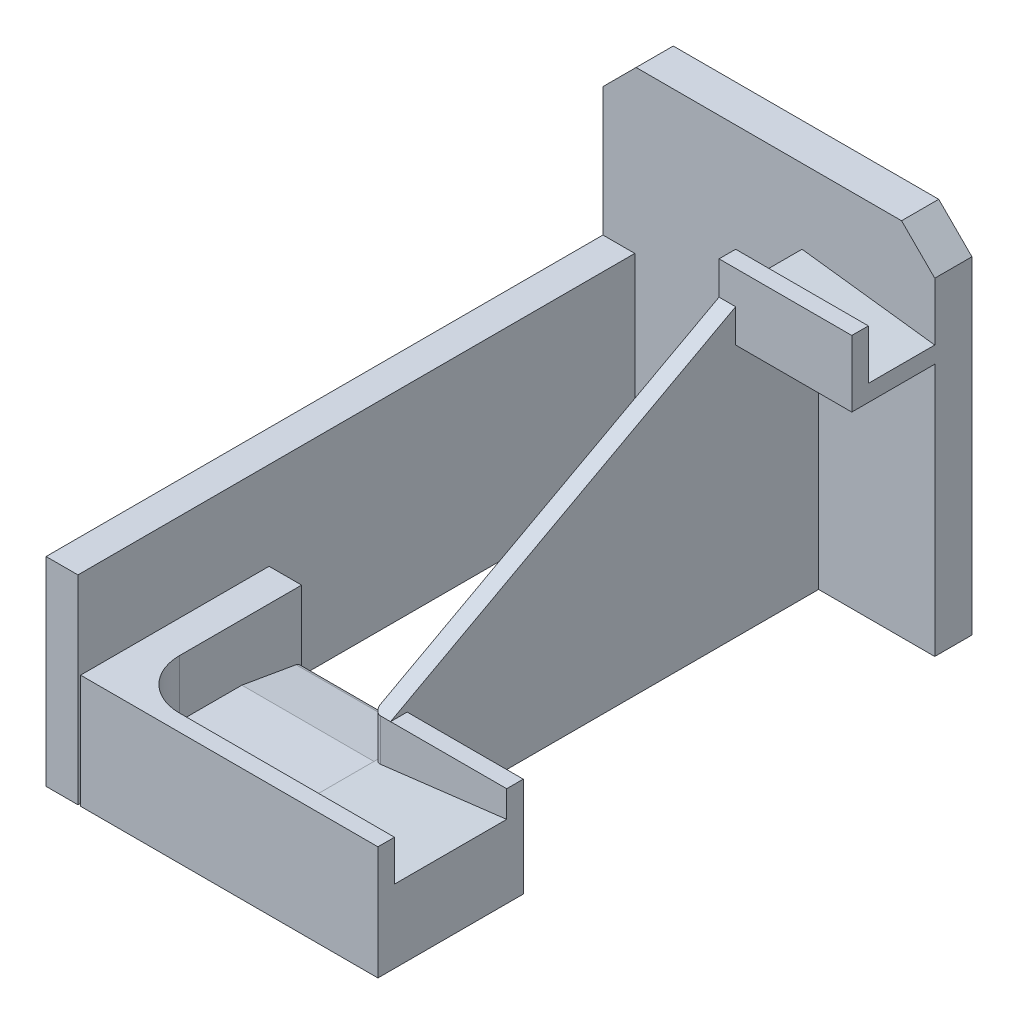
ISO-10303-21;
HEADER;
FILE_DESCRIPTION(('STEP AP214'),'2;1');
FILE_NAME('part.step','',(''),(''),'','','');
FILE_SCHEMA(('AUTOMOTIVE_DESIGN { 1 0 10303 214 1 1 1 1 }'));
ENDSEC;
DATA;
#1=APPLICATION_CONTEXT('core data for automotive mechanical design processes');
#2=APPLICATION_PROTOCOL_DEFINITION('international standard','automotive_design',2000,#1);
#3=PRODUCT_CONTEXT('',#1,'mechanical');
#4=PRODUCT('Part','Part','',(#3));
#5=PRODUCT_RELATED_PRODUCT_CATEGORY('part','',(#4));
#6=PRODUCT_DEFINITION_FORMATION('','',#4);
#7=PRODUCT_DEFINITION_CONTEXT('part definition',#1,'design');
#8=PRODUCT_DEFINITION('design','',#6,#7);
#9=PRODUCT_DEFINITION_SHAPE('','',#8);
#10=(LENGTH_UNIT() NAMED_UNIT(*) SI_UNIT(.MILLI.,.METRE.));
#11=(NAMED_UNIT(*) PLANE_ANGLE_UNIT() SI_UNIT($,.RADIAN.));
#12=(NAMED_UNIT(*) SI_UNIT($,.STERADIAN.) SOLID_ANGLE_UNIT());
#13=UNCERTAINTY_MEASURE_WITH_UNIT(LENGTH_MEASURE(1.E-05),#10,'distance_accuracy_value','');
#14=(GEOMETRIC_REPRESENTATION_CONTEXT(3) GLOBAL_UNCERTAINTY_ASSIGNED_CONTEXT((#13)) GLOBAL_UNIT_ASSIGNED_CONTEXT((#10,
#11,#12)) REPRESENTATION_CONTEXT('',''));
#15=CARTESIAN_POINT('',(0.,0.,0.));
#16=DIRECTION('',(0.,0.,1.));
#17=DIRECTION('',(1.,0.,0.));
#18=AXIS2_PLACEMENT_3D('',#15,#16,#17);
#19=CARTESIAN_POINT('',(10.1,0.,0.));
#20=DIRECTION('',(1.,0.,0.));
#21=DIRECTION('',(0.,0.,-1.));
#22=AXIS2_PLACEMENT_3D('',#19,#20,#21);
#23=PLANE('',#22);
#24=DIRECTION('',(0.,0.,-1.));
#25=VECTOR('',#24,1.);
#26=CARTESIAN_POINT('',(10.1,17.12,61.1));
#27=LINE('',#26,#25);
#28=CARTESIAN_POINT('',(10.1,17.12,79.4999999999999));
#29=VERTEX_POINT('',#28);
#30=CARTESIAN_POINT('',(10.1,17.12,61.1));
#31=VERTEX_POINT('',#30);
#32=EDGE_CURVE('E268',#29,#31,#27,.T.);
#33=ORIENTED_EDGE('',*,*,#32,.F.);
#34=DIRECTION('',(0.,-1.,0.));
#35=VECTOR('',#34,1.);
#36=CARTESIAN_POINT('',(10.1,27.7266017177982,79.4999999999999));
#37=LINE('',#36,#35);
#38=CARTESIAN_POINT('',(10.1,8.55999999999962,79.4999999999999));
#39=VERTEX_POINT('',#38);
#40=EDGE_CURVE('E266',#29,#39,#37,.T.);
#41=ORIENTED_EDGE('',*,*,#40,.T.);
#42=DIRECTION('',(0.,0.,1.));
#43=VECTOR('',#42,1.);
#44=CARTESIAN_POINT('',(10.1,8.55999999999993,70.1));
#45=LINE('',#44,#43);
#46=CARTESIAN_POINT('',(10.1,8.55999999999993,70.1));
#47=VERTEX_POINT('',#46);
#48=EDGE_CURVE('E251',#47,#39,#45,.T.);
#49=ORIENTED_EDGE('',*,*,#48,.F.);
#50=DIRECTION('',(0.,0.17078672353593,0.985308020399642));
#51=VECTOR('',#50,1.);
#52=CARTESIAN_POINT('',(10.1,7.,61.1));
#53=LINE('',#52,#51);
#54=CARTESIAN_POINT('',(10.1,7.14373030125377,61.9292132764641));
#55=VERTEX_POINT('',#54);
#56=EDGE_CURVE('E449',#55,#47,#53,.T.);
#57=ORIENTED_EDGE('',*,*,#56,.F.);
#58=CARTESIAN_POINT('',(10.1,6.15842228085412,62.1));
#59=DIRECTION('',(1.,0.,0.));
#60=DIRECTION('',(0.,0.,-1.));
#61=AXIS2_PLACEMENT_3D('',#58,#59,#60);
#62=CIRCLE('',#61,1.);
#63=CARTESIAN_POINT('',(10.1,6.15842228085412,61.1));
#64=VERTEX_POINT('',#63);
#65=EDGE_CURVE('E503',#55,#64,#62,.F.);
#66=ORIENTED_EDGE('',*,*,#65,.T.);
#67=DIRECTION('',(0.,-1.,0.));
#68=VECTOR('',#67,1.);
#69=CARTESIAN_POINT('',(10.1,0.,61.1));
#70=LINE('',#69,#68);
#71=EDGE_CURVE('E476',#31,#64,#70,.T.);
#72=ORIENTED_EDGE('',*,*,#71,.F.);
#73=EDGE_LOOP('',(#33,#41,#49,#57,#66,#72));
#74=FACE_BOUND('',#73,.T.);
#75=ADVANCED_FACE('F35',(#74),#23,.T.);
#76=CARTESIAN_POINT('',(57.2778958132771,8.55999999999993,70.1));
#77=DIRECTION('',(0.,-1.,0.));
#78=DIRECTION('',(0.,0.,-1.));
#79=AXIS2_PLACEMENT_3D('',#76,#77,#78);
#80=PLANE('',#79);
#81=CARTESIAN_POINT('',(17.6,8.55999999999962,79.4999999999999));
#82=DIRECTION('',(0.,-1.,0.));
#83=DIRECTION('',(0.,0.,1.));
#84=AXIS2_PLACEMENT_3D('',#81,#82,#83);
#85=CIRCLE('',#84,7.50000000000001);
#86=CARTESIAN_POINT('',(17.6,8.56,87.));
#87=VERTEX_POINT('',#86);
#88=EDGE_CURVE('E256',#87,#39,#85,.T.);
#89=ORIENTED_EDGE('',*,*,#88,.F.);
#90=DIRECTION('',(-1.,0.,0.));
#91=VECTOR('',#90,1.);
#92=CARTESIAN_POINT('',(57.2778958132771,8.56,87.));
#93=LINE('',#92,#91);
#94=CARTESIAN_POINT('',(30.,8.56,87.));
#95=VERTEX_POINT('',#94);
#96=EDGE_CURVE('E263',#95,#87,#93,.T.);
#97=ORIENTED_EDGE('',*,*,#96,.F.);
#98=DIRECTION('',(0.,0.,1.));
#99=VECTOR('',#98,1.);
#100=CARTESIAN_POINT('',(30.,8.55999999999993,70.1));
#101=LINE('',#100,#99);
#102=CARTESIAN_POINT('',(30.,8.55999999999993,70.1));
#103=VERTEX_POINT('',#102);
#104=EDGE_CURVE('E452',#103,#95,#101,.T.);
#105=ORIENTED_EDGE('',*,*,#104,.F.);
#106=DIRECTION('',(-1.,0.,0.));
#107=VECTOR('',#106,1.);
#108=CARTESIAN_POINT('',(57.2778958132771,8.55999999999993,70.1));
#109=LINE('',#108,#107);
#110=EDGE_CURVE('E260',#103,#47,#109,.T.);
#111=ORIENTED_EDGE('',*,*,#110,.T.);
#112=ORIENTED_EDGE('',*,*,#48,.T.);
#113=EDGE_LOOP('',(#89,#97,#105,#111,#112));
#114=FACE_BOUND('',#113,.T.);
#115=ADVANCED_FACE('F253',(#114),#80,.F.);
#116=CARTESIAN_POINT('',(0.,0.,5.6));
#117=DIRECTION('',(0.,0.,-1.));
#118=DIRECTION('',(-1.,0.,0.));
#119=AXIS2_PLACEMENT_3D('',#116,#117,#118);
#120=PLANE('',#119);
#121=DIRECTION('',(0.,1.,0.));
#122=VECTOR('',#121,1.);
#123=CARTESIAN_POINT('',(4.8,0.,5.6));
#124=LINE('',#123,#122);
#125=CARTESIAN_POINT('',(4.8,0.,5.6));
#126=VERTEX_POINT('',#125);
#127=CARTESIAN_POINT('',(4.8,30.,5.6));
#128=VERTEX_POINT('',#127);
#129=EDGE_CURVE('E287',#126,#128,#124,.T.);
#130=ORIENTED_EDGE('',*,*,#129,.F.);
#131=DIRECTION('',(1.,0.,0.));
#132=VECTOR('',#131,1.);
#133=CARTESIAN_POINT('',(0.,0.,5.6));
#134=LINE('',#133,#132);
#135=CARTESIAN_POINT('',(30.,0.,5.6));
#136=VERTEX_POINT('',#135);
#137=EDGE_CURVE('E409',#126,#136,#134,.T.);
#138=ORIENTED_EDGE('',*,*,#137,.T.);
#139=DIRECTION('',(0.,1.,0.));
#140=VECTOR('',#139,1.);
#141=CARTESIAN_POINT('',(30.,43.145,5.60000000001537));
#142=LINE('',#141,#140);
#143=CARTESIAN_POINT('',(30.,43.145,5.60000000001537));
#144=VERTEX_POINT('',#143);
#145=EDGE_CURVE('E393',#136,#144,#142,.T.);
#146=ORIENTED_EDGE('',*,*,#145,.T.);
#147=DIRECTION('',(0.992277876713668,-0.124034734589208,0.));
#148=VECTOR('',#147,1.);
#149=CARTESIAN_POINT('',(30.,43.145,5.60000000001537));
#150=LINE('',#149,#148);
#151=CARTESIAN_POINT('',(50.,40.645,5.60000000001537));
#152=VERTEX_POINT('',#151);
#153=EDGE_CURVE('E400',#144,#152,#150,.T.);
#154=ORIENTED_EDGE('',*,*,#153,.T.);
#155=DIRECTION('',(0.,1.,0.));
#156=VECTOR('',#155,1.);
#157=CARTESIAN_POINT('',(50.,0.,5.6));
#158=LINE('',#157,#156);
#159=CARTESIAN_POINT('',(50.,49.365,5.6));
#160=VERTEX_POINT('',#159);
#161=EDGE_CURVE('E411',#152,#160,#158,.T.);
#162=ORIENTED_EDGE('',*,*,#161,.T.);
#163=DIRECTION('',(-0.707106781186547,0.707106781186547,0.));
#164=VECTOR('',#163,1.);
#165=CARTESIAN_POINT('',(45.,54.365,5.6));
#166=LINE('',#165,#164);
#167=CARTESIAN_POINT('',(45.,54.365,5.6));
#168=VERTEX_POINT('',#167);
#169=EDGE_CURVE('E415',#160,#168,#166,.T.);
#170=ORIENTED_EDGE('',*,*,#169,.T.);
#171=DIRECTION('',(-1.,0.,0.));
#172=VECTOR('',#171,1.);
#173=CARTESIAN_POINT('',(5.,54.365,5.6));
#174=LINE('',#173,#172);
#175=CARTESIAN_POINT('',(5.,54.365,5.6));
#176=VERTEX_POINT('',#175);
#177=EDGE_CURVE('E417',#168,#176,#174,.T.);
#178=ORIENTED_EDGE('',*,*,#177,.T.);
#179=DIRECTION('',(-0.707106781186548,-0.707106781186547,0.));
#180=VECTOR('',#179,1.);
#181=CARTESIAN_POINT('',(0.,49.365,5.6));
#182=LINE('',#181,#180);
#183=CARTESIAN_POINT('',(0.,49.365,5.6));
#184=VERTEX_POINT('',#183);
#185=EDGE_CURVE('E419',#176,#184,#182,.T.);
#186=ORIENTED_EDGE('',*,*,#185,.T.);
#187=DIRECTION('',(0.,-1.,0.));
#188=VECTOR('',#187,1.);
#189=CARTESIAN_POINT('',(0.,0.,5.6));
#190=LINE('',#189,#188);
#191=CARTESIAN_POINT('',(0.,30.,5.6));
#192=VERTEX_POINT('',#191);
#193=EDGE_CURVE('E405',#184,#192,#190,.T.);
#194=ORIENTED_EDGE('',*,*,#193,.T.);
#195=DIRECTION('',(-1.,0.,0.));
#196=VECTOR('',#195,1.);
#197=CARTESIAN_POINT('',(0.,30.,5.6));
#198=LINE('',#197,#196);
#199=EDGE_CURVE('E282',#128,#192,#198,.T.);
#200=ORIENTED_EDGE('',*,*,#199,.F.);
#201=EDGE_LOOP('',(#130,#138,#146,#154,#162,#170,#178,#186,#194,#200));
#202=FACE_BOUND('',#201,.T.);
#203=ADVANCED_FACE('F582',(#202),#120,.F.);
#204=CARTESIAN_POINT('',(0.,0.,87.));
#205=DIRECTION('',(0.,0.,-1.));
#206=DIRECTION('',(-1.,0.,0.));
#207=AXIS2_PLACEMENT_3D('',#204,#205,#206);
#208=PLANE('',#207);
#209=DIRECTION('',(0.,-1.,0.));
#210=VECTOR('',#209,1.);
#211=CARTESIAN_POINT('',(17.6,27.7266017177982,87.));
#212=LINE('',#211,#210);
#213=CARTESIAN_POINT('',(17.6,17.1199999999999,87.));
#214=VERTEX_POINT('',#213);
#215=EDGE_CURVE('E276',#214,#87,#212,.T.);
#216=ORIENTED_EDGE('',*,*,#215,.F.);
#217=DIRECTION('',(-1.,0.,0.));
#218=VECTOR('',#217,1.);
#219=CARTESIAN_POINT('',(10.1,17.1199999999999,87.));
#220=LINE('',#219,#218);
#221=CARTESIAN_POINT('',(50.,17.1199999999999,87.));
#222=VERTEX_POINT('',#221);
#223=EDGE_CURVE('E464',#222,#214,#220,.T.);
#224=ORIENTED_EDGE('',*,*,#223,.F.);
#225=DIRECTION('',(0.,1.,0.));
#226=VECTOR('',#225,1.);
#227=CARTESIAN_POINT('',(50.,0.,87.));
#228=LINE('',#227,#226);
#229=CARTESIAN_POINT('',(50.,11.,87.));
#230=VERTEX_POINT('',#229);
#231=EDGE_CURVE('E462',#230,#222,#228,.T.);
#232=ORIENTED_EDGE('',*,*,#231,.F.);
#233=DIRECTION('',(0.992640057880681,0.121102087061447,0.));
#234=VECTOR('',#233,1.);
#235=CARTESIAN_POINT('',(30.,8.55999999999993,86.9999999999891));
#236=LINE('',#235,#234);
#237=EDGE_CURVE('E313',#95,#230,#236,.T.);
#238=ORIENTED_EDGE('',*,*,#237,.F.);
#239=ORIENTED_EDGE('',*,*,#96,.T.);
#240=EDGE_LOOP('',(#216,#224,#232,#238,#239));
#241=FACE_BOUND('',#240,.T.);
#242=ADVANCED_FACE('F580',(#241),#208,.T.);
#243=CARTESIAN_POINT('',(32.5,15.,70.1));
#244=DIRECTION('',(0.,0.,1.));
#245=DIRECTION('',(1.,0.,0.));
#246=AXIS2_PLACEMENT_3D('',#243,#244,#245);
#247=PLANE('',#246);
#248=DIRECTION('',(-1.,0.,0.));
#249=VECTOR('',#248,1.);
#250=CARTESIAN_POINT('',(32.5,15.,70.1));
#251=LINE('',#250,#249);
#252=CARTESIAN_POINT('',(32.5,15.,70.1));
#253=VERTEX_POINT('',#252);
#254=CARTESIAN_POINT('',(31.,15.,70.1));
#255=VERTEX_POINT('',#254);
#256=EDGE_CURVE('E352',#253,#255,#251,.T.);
#257=ORIENTED_EDGE('',*,*,#256,.T.);
#258=DIRECTION('',(0.,1.,0.));
#259=VECTOR('',#258,1.);
#260=CARTESIAN_POINT('',(31.,8.55999999999993,70.1));
#261=LINE('',#260,#259);
#262=CARTESIAN_POINT('',(31.,8.68199999999993,70.1));
#263=VERTEX_POINT('',#262);
#264=EDGE_CURVE('E43',#255,#263,#261,.F.);
#265=ORIENTED_EDGE('',*,*,#264,.T.);
#266=DIRECTION('',(-0.992640057880681,-0.121102087061447,0.));
#267=VECTOR('',#266,1.);
#268=CARTESIAN_POINT('',(30.,8.55999999999993,70.1));
#269=LINE('',#268,#267);
#270=CARTESIAN_POINT('',(50.,11.,70.1));
#271=VERTEX_POINT('',#270);
#272=EDGE_CURVE('E294',#271,#263,#269,.T.);
#273=ORIENTED_EDGE('',*,*,#272,.F.);
#274=DIRECTION('',(0.,1.,0.));
#275=VECTOR('',#274,1.);
#276=CARTESIAN_POINT('',(50.,0.,70.1));
#277=LINE('',#276,#275);
#278=CARTESIAN_POINT('',(50.,15.,70.1));
#279=VERTEX_POINT('',#278);
#280=EDGE_CURVE('E316',#271,#279,#277,.T.);
#281=ORIENTED_EDGE('',*,*,#280,.T.);
#282=DIRECTION('',(-1.,0.,0.));
#283=VECTOR('',#282,1.);
#284=CARTESIAN_POINT('',(32.5,15.,70.1));
#285=LINE('',#284,#283);
#286=EDGE_CURVE('E321',#279,#253,#285,.T.);
#287=ORIENTED_EDGE('',*,*,#286,.T.);
#288=EDGE_LOOP('',(#257,#265,#273,#281,#287));
#289=FACE_BOUND('',#288,.T.);
#290=ADVANCED_FACE('F520',(#289),#247,.T.);
#291=CARTESIAN_POINT('',(10.1,0.,61.1));
#292=DIRECTION('',(0.,0.,-1.));
#293=DIRECTION('',(-1.,0.,0.));
#294=AXIS2_PLACEMENT_3D('',#291,#292,#293);
#295=PLANE('',#294);
#296=ORIENTED_EDGE('',*,*,#71,.T.);
#297=DIRECTION('',(-1.,0.,0.));
#298=VECTOR('',#297,1.);
#299=CARTESIAN_POINT('',(30.,6.15842228085412,61.1));
#300=LINE('',#299,#298);
#301=CARTESIAN_POINT('',(30.,6.15842228085412,61.1));
#302=VERTEX_POINT('',#301);
#303=EDGE_CURVE('E501',#64,#302,#300,.F.);
#304=ORIENTED_EDGE('',*,*,#303,.T.);
#305=DIRECTION('',(0.,1.,0.));
#306=VECTOR('',#305,1.);
#307=CARTESIAN_POINT('',(30.,0.,61.1));
#308=LINE('',#307,#306);
#309=CARTESIAN_POINT('',(30.,0.,61.1));
#310=VERTEX_POINT('',#309);
#311=EDGE_CURVE('E457',#310,#302,#308,.T.);
#312=ORIENTED_EDGE('',*,*,#311,.F.);
#313=DIRECTION('',(-1.,0.,0.));
#314=VECTOR('',#313,1.);
#315=CARTESIAN_POINT('',(10.1,0.,61.1));
#316=LINE('',#315,#314);
#317=CARTESIAN_POINT('',(5.2,0.,61.1));
#318=VERTEX_POINT('',#317);
#319=EDGE_CURVE('E480',#310,#318,#316,.T.);
#320=ORIENTED_EDGE('',*,*,#319,.T.);
#321=DIRECTION('',(0.,-1.,0.));
#322=VECTOR('',#321,1.);
#323=CARTESIAN_POINT('',(5.2,0.,61.1));
#324=LINE('',#323,#322);
#325=CARTESIAN_POINT('',(5.2,17.12,61.1));
#326=VERTEX_POINT('',#325);
#327=EDGE_CURVE('E473',#326,#318,#324,.T.);
#328=ORIENTED_EDGE('',*,*,#327,.F.);
#329=DIRECTION('',(-1.,0.,0.));
#330=VECTOR('',#329,1.);
#331=CARTESIAN_POINT('',(10.1,17.12,61.1));
#332=LINE('',#331,#330);
#333=EDGE_CURVE('E491',#31,#326,#332,.T.);
#334=ORIENTED_EDGE('',*,*,#333,.F.);
#335=EDGE_LOOP('',(#296,#304,#312,#320,#328,#334));
#336=FACE_BOUND('',#335,.T.);
#337=ADVANCED_FACE('F571',(#336),#295,.T.);
#338=CARTESIAN_POINT('',(10.1,17.12,61.1));
#339=DIRECTION('',(0.,1.,0.));
#340=DIRECTION('',(0.,0.,1.));
#341=AXIS2_PLACEMENT_3D('',#338,#339,#340);
#342=PLANE('',#341);
#343=CARTESIAN_POINT('',(17.6,17.12,79.4999999999999));
#344=DIRECTION('',(0.,1.,0.));
#345=DIRECTION('',(0.,0.,1.));
#346=AXIS2_PLACEMENT_3D('',#343,#344,#345);
#347=CIRCLE('',#346,7.50000000000001);
#348=EDGE_CURVE('E272',#214,#29,#347,.F.);
#349=ORIENTED_EDGE('',*,*,#348,.T.);
#350=ORIENTED_EDGE('',*,*,#32,.T.);
#351=ORIENTED_EDGE('',*,*,#333,.T.);
#352=DIRECTION('',(0.,0.,-1.));
#353=VECTOR('',#352,1.);
#354=CARTESIAN_POINT('',(5.2,17.12,61.1));
#355=LINE('',#354,#353);
#356=CARTESIAN_POINT('',(5.2,17.12,89.5));
#357=VERTEX_POINT('',#356);
#358=EDGE_CURVE('E478',#357,#326,#355,.T.);
#359=ORIENTED_EDGE('',*,*,#358,.F.);
#360=DIRECTION('',(-1.,0.,0.));
#361=VECTOR('',#360,1.);
#362=CARTESIAN_POINT('',(10.1,17.12,89.5));
#363=LINE('',#362,#361);
#364=CARTESIAN_POINT('',(50.,17.1199999999999,89.5));
#365=VERTEX_POINT('',#364);
#366=EDGE_CURVE('E494',#365,#357,#363,.T.);
#367=ORIENTED_EDGE('',*,*,#366,.F.);
#368=DIRECTION('',(0.,0.,1.));
#369=VECTOR('',#368,1.);
#370=CARTESIAN_POINT('',(50.,17.1199999999999,87.));
#371=LINE('',#370,#369);
#372=EDGE_CURVE('E470',#222,#365,#371,.T.);
#373=ORIENTED_EDGE('',*,*,#372,.F.);
#374=ORIENTED_EDGE('',*,*,#223,.T.);
#375=EDGE_LOOP('',(#349,#350,#351,#359,#367,#373,#374));
#376=FACE_BOUND('',#375,.T.);
#377=ADVANCED_FACE('F578',(#376),#342,.T.);
#378=CARTESIAN_POINT('',(10.1,0.,89.5));
#379=DIRECTION('',(0.,0.,1.));
#380=DIRECTION('',(0.,-1.,0.));
#381=AXIS2_PLACEMENT_3D('',#378,#379,#380);
#382=PLANE('',#381);
#383=DIRECTION('',(0.,1.,0.));
#384=VECTOR('',#383,1.);
#385=CARTESIAN_POINT('',(5.2,0.,89.5));
#386=LINE('',#385,#384);
#387=CARTESIAN_POINT('',(5.2,0.,89.5));
#388=VERTEX_POINT('',#387);
#389=EDGE_CURVE('E486',#388,#357,#386,.T.);
#390=ORIENTED_EDGE('',*,*,#389,.F.);
#391=DIRECTION('',(-1.,0.,0.));
#392=VECTOR('',#391,1.);
#393=CARTESIAN_POINT('',(10.1,0.,89.5));
#394=LINE('',#393,#392);
#395=CARTESIAN_POINT('',(50.,0.,89.5));
#396=VERTEX_POINT('',#395);
#397=EDGE_CURVE('E496',#396,#388,#394,.T.);
#398=ORIENTED_EDGE('',*,*,#397,.F.);
#399=DIRECTION('',(0.,1.,0.));
#400=VECTOR('',#399,1.);
#401=CARTESIAN_POINT('',(50.,0.,89.5));
#402=LINE('',#401,#400);
#403=EDGE_CURVE('E454',#396,#365,#402,.T.);
#404=ORIENTED_EDGE('',*,*,#403,.T.);
#405=ORIENTED_EDGE('',*,*,#366,.T.);
#406=EDGE_LOOP('',(#390,#398,#404,#405));
#407=FACE_BOUND('',#406,.T.);
#408=ADVANCED_FACE('F606',(#407),#382,.T.);
#409=CARTESIAN_POINT('',(10.1,0.,61.1));
#410=DIRECTION('',(0.,-1.,0.));
#411=DIRECTION('',(0.,0.,-1.));
#412=AXIS2_PLACEMENT_3D('',#409,#410,#411);
#413=PLANE('',#412);
#414=DIRECTION('',(1.,0.,0.));
#415=VECTOR('',#414,1.);
#416=CARTESIAN_POINT('',(32.5,0.,67.6));
#417=LINE('',#416,#415);
#418=CARTESIAN_POINT('',(32.5,0.,67.6));
#419=VERTEX_POINT('',#418);
#420=CARTESIAN_POINT('',(50.,0.,67.6));
#421=VERTEX_POINT('',#420);
#422=EDGE_CURVE('E320',#419,#421,#417,.T.);
#423=ORIENTED_EDGE('',*,*,#422,.T.);
#424=DIRECTION('',(0.,0.,1.));
#425=VECTOR('',#424,1.);
#426=CARTESIAN_POINT('',(50.,0.,87.));
#427=LINE('',#426,#425);
#428=EDGE_CURVE('E467',#421,#396,#427,.T.);
#429=ORIENTED_EDGE('',*,*,#428,.T.);
#430=ORIENTED_EDGE('',*,*,#397,.T.);
#431=DIRECTION('',(0.,0.,1.));
#432=VECTOR('',#431,1.);
#433=CARTESIAN_POINT('',(5.2,0.,61.1));
#434=LINE('',#433,#432);
#435=EDGE_CURVE('E483',#318,#388,#434,.T.);
#436=ORIENTED_EDGE('',*,*,#435,.F.);
#437=ORIENTED_EDGE('',*,*,#319,.F.);
#438=DIRECTION('',(0.,0.,1.));
#439=VECTOR('',#438,1.);
#440=CARTESIAN_POINT('',(30.,0.,70.1));
#441=LINE('',#440,#439);
#442=EDGE_CURVE('E336',#136,#310,#441,.T.);
#443=ORIENTED_EDGE('',*,*,#442,.F.);
#444=ORIENTED_EDGE('',*,*,#137,.F.);
#445=DIRECTION('',(0.,0.,-1.));
#446=VECTOR('',#445,1.);
#447=CARTESIAN_POINT('',(4.8,0.,119.881573362813));
#448=LINE('',#447,#446);
#449=CARTESIAN_POINT('',(4.8,0.,89.5));
#450=VERTEX_POINT('',#449);
#451=EDGE_CURVE('E290',#450,#126,#448,.T.);
#452=ORIENTED_EDGE('',*,*,#451,.F.);
#453=DIRECTION('',(1.,0.,0.));
#454=VECTOR('',#453,1.);
#455=CARTESIAN_POINT('',(0.,0.,89.5));
#456=LINE('',#455,#454);
#457=CARTESIAN_POINT('',(0.,0.,89.5));
#458=VERTEX_POINT('',#457);
#459=EDGE_CURVE('E295',#458,#450,#456,.T.);
#460=ORIENTED_EDGE('',*,*,#459,.F.);
#461=DIRECTION('',(0.,0.,-1.));
#462=VECTOR('',#461,1.);
#463=CARTESIAN_POINT('',(0.,0.,5.6));
#464=LINE('',#463,#462);
#465=CARTESIAN_POINT('',(0.,0.,0.));
#466=VERTEX_POINT('',#465);
#467=EDGE_CURVE('E447',#458,#466,#464,.T.);
#468=ORIENTED_EDGE('',*,*,#467,.T.);
#469=DIRECTION('',(1.,0.,0.));
#470=VECTOR('',#469,1.);
#471=CARTESIAN_POINT('',(0.,0.,0.));
#472=LINE('',#471,#470);
#473=CARTESIAN_POINT('',(50.,0.,0.));
#474=VERTEX_POINT('',#473);
#475=EDGE_CURVE('E424',#466,#474,#472,.T.);
#476=ORIENTED_EDGE('',*,*,#475,.T.);
#477=DIRECTION('',(0.,0.,-1.));
#478=VECTOR('',#477,1.);
#479=CARTESIAN_POINT('',(50.,0.,5.6));
#480=LINE('',#479,#478);
#481=CARTESIAN_POINT('',(50.,0.,5.6));
#482=VERTEX_POINT('',#481);
#483=EDGE_CURVE('E444',#482,#474,#480,.T.);
#484=ORIENTED_EDGE('',*,*,#483,.F.);
#485=CARTESIAN_POINT('',(32.5,0.,5.6));
#486=VERTEX_POINT('',#485);
#487=EDGE_CURVE('E407',#486,#482,#134,.T.);
#488=ORIENTED_EDGE('',*,*,#487,.F.);
#489=DIRECTION('',(0.,0.,1.));
#490=VECTOR('',#489,1.);
#491=CARTESIAN_POINT('',(32.5,0.,70.1));
#492=LINE('',#491,#490);
#493=EDGE_CURVE('E346',#486,#419,#492,.T.);
#494=ORIENTED_EDGE('',*,*,#493,.T.);
#495=EDGE_LOOP('',(#423,#429,#430,#436,#437,#443,#444,#452,#460,#468,#476,#484,#488,#494));
#496=FACE_BOUND('',#495,.T.);
#497=ADVANCED_FACE('F565',(#496),#413,.T.);
#498=CARTESIAN_POINT('',(5.2,0.,0.));
#499=DIRECTION('',(1.,0.,0.));
#500=DIRECTION('',(0.,0.,-1.));
#501=AXIS2_PLACEMENT_3D('',#498,#499,#500);
#502=PLANE('',#501);
#503=ORIENTED_EDGE('',*,*,#327,.T.);
#504=ORIENTED_EDGE('',*,*,#435,.T.);
#505=ORIENTED_EDGE('',*,*,#389,.T.);
#506=ORIENTED_EDGE('',*,*,#358,.T.);
#507=EDGE_LOOP('',(#503,#504,#505,#506));
#508=FACE_BOUND('',#507,.T.);
#509=ADVANCED_FACE('F600',(#508),#502,.F.);
#510=CARTESIAN_POINT('',(50.,0.,87.));
#511=DIRECTION('',(1.,0.,0.));
#512=DIRECTION('',(0.,0.,-1.));
#513=AXIS2_PLACEMENT_3D('',#510,#511,#512);
#514=PLANE('',#513);
#515=ORIENTED_EDGE('',*,*,#403,.F.);
#516=ORIENTED_EDGE('',*,*,#428,.F.);
#517=DIRECTION('',(0.,1.,0.));
#518=VECTOR('',#517,1.);
#519=CARTESIAN_POINT('',(50.,0.,67.6));
#520=LINE('',#519,#518);
#521=CARTESIAN_POINT('',(50.,15.,67.6));
#522=VERTEX_POINT('',#521);
#523=EDGE_CURVE('E324',#421,#522,#520,.T.);
#524=ORIENTED_EDGE('',*,*,#523,.T.);
#525=DIRECTION('',(0.,0.,1.));
#526=VECTOR('',#525,1.);
#527=CARTESIAN_POINT('',(50.,15.,67.6));
#528=LINE('',#527,#526);
#529=EDGE_CURVE('E330',#522,#279,#528,.T.);
#530=ORIENTED_EDGE('',*,*,#529,.T.);
#531=ORIENTED_EDGE('',*,*,#280,.F.);
#532=DIRECTION('',(0.,0.,-1.));
#533=VECTOR('',#532,1.);
#534=CARTESIAN_POINT('',(50.,11.,500000.));
#535=LINE('',#534,#533);
#536=EDGE_CURVE('E310',#230,#271,#535,.T.);
#537=ORIENTED_EDGE('',*,*,#536,.F.);
#538=ORIENTED_EDGE('',*,*,#231,.T.);
#539=ORIENTED_EDGE('',*,*,#372,.T.);
#540=EDGE_LOOP('',(#515,#516,#524,#530,#531,#537,#538,#539));
#541=FACE_BOUND('',#540,.T.);
#542=ADVANCED_FACE('F535',(#541),#514,.T.);
#543=CARTESIAN_POINT('',(57.2778958132771,7.,61.1));
#544=DIRECTION('',(0.,-0.985308020399642,0.17078672353593));
#545=DIRECTION('',(0.,-0.17078672353593,-0.985308020399642));
#546=AXIS2_PLACEMENT_3D('',#543,#544,#545);
#547=PLANE('',#546);
#548=DIRECTION('',(0.,0.17078672353593,0.985308020399642));
#549=VECTOR('',#548,1.);
#550=CARTESIAN_POINT('',(30.,7.,61.1));
#551=LINE('',#550,#549);
#552=CARTESIAN_POINT('',(30.,7.14373030125377,61.9292132764641));
#553=VERTEX_POINT('',#552);
#554=EDGE_CURVE('E455',#553,#103,#551,.T.);
#555=ORIENTED_EDGE('',*,*,#554,.F.);
#556=DIRECTION('',(-1.,0.,0.));
#557=VECTOR('',#556,1.);
#558=CARTESIAN_POINT('',(10.1,7.14373030125377,61.9292132764641));
#559=LINE('',#558,#557);
#560=EDGE_CURVE('E493',#553,#55,#559,.T.);
#561=ORIENTED_EDGE('',*,*,#560,.T.);
#562=ORIENTED_EDGE('',*,*,#56,.T.);
#563=ORIENTED_EDGE('',*,*,#110,.F.);
#564=EDGE_LOOP('',(#555,#561,#562,#563));
#565=FACE_BOUND('',#564,.T.);
#566=ADVANCED_FACE('F530',(#565),#547,.F.);
#567=DIRECTION('',(0.,-1.,-4.02949727589265E-13));
#568=VECTOR('',#567,1.);
#569=CARTESIAN_POINT('',(32.5,38.145,5.60000000001537));
#570=LINE('',#569,#568);
#571=CARTESIAN_POINT('',(32.5,38.145,5.60000000001537));
#572=VERTEX_POINT('',#571);
#573=EDGE_CURVE('E344',#572,#486,#570,.T.);
#574=ORIENTED_EDGE('',*,*,#573,.T.);
#575=ORIENTED_EDGE('',*,*,#487,.T.);
#576=CARTESIAN_POINT('',(50.,38.145,5.60000000001537));
#577=VERTEX_POINT('',#576);
#578=EDGE_CURVE('E412',#482,#577,#158,.T.);
#579=ORIENTED_EDGE('',*,*,#578,.T.);
#580=DIRECTION('',(-1.,0.,0.));
#581=VECTOR('',#580,1.);
#582=CARTESIAN_POINT('',(30.,38.145,5.60000000001537));
#583=LINE('',#582,#581);
#584=EDGE_CURVE('E383',#577,#572,#583,.T.);
#585=ORIENTED_EDGE('',*,*,#584,.T.);
#586=EDGE_LOOP('',(#574,#575,#579,#585));
#587=FACE_BOUND('',#586,.T.);
#588=ADVANCED_FACE('F590',(#587),#120,.F.);
#589=CARTESIAN_POINT('',(30.,38.145,-500000.));
#590=DIRECTION('',(0.,1.,0.));
#591=DIRECTION('',(-1.,0.,0.));
#592=AXIS2_PLACEMENT_3D('',#589,#590,#591);
#593=PLANE('',#592);
#594=DIRECTION('',(0.,0.,-1.));
#595=VECTOR('',#594,1.);
#596=CARTESIAN_POINT('',(32.5,38.145,18.1));
#597=LINE('',#596,#595);
#598=CARTESIAN_POINT('',(32.5,38.145,18.1));
#599=VERTEX_POINT('',#598);
#600=EDGE_CURVE('E341',#599,#572,#597,.T.);
#601=ORIENTED_EDGE('',*,*,#600,.T.);
#602=ORIENTED_EDGE('',*,*,#584,.F.);
#603=DIRECTION('',(0.,0.,1.));
#604=VECTOR('',#603,1.);
#605=CARTESIAN_POINT('',(50.,38.145,-500000.));
#606=LINE('',#605,#604);
#607=CARTESIAN_POINT('',(50.,38.145,18.1));
#608=VERTEX_POINT('',#607);
#609=EDGE_CURVE('E388',#577,#608,#606,.T.);
#610=ORIENTED_EDGE('',*,*,#609,.T.);
#611=DIRECTION('',(1.,0.,0.));
#612=VECTOR('',#611,1.);
#613=CARTESIAN_POINT('',(50.,38.145,18.1));
#614=LINE('',#613,#612);
#615=EDGE_CURVE('E370',#599,#608,#614,.T.);
#616=ORIENTED_EDGE('',*,*,#615,.F.);
#617=EDGE_LOOP('',(#601,#602,#610,#616));
#618=FACE_BOUND('',#617,.T.);
#619=ADVANCED_FACE('F645',(#618),#593,.F.);
#620=CARTESIAN_POINT('',(0.,0.,5.6));
#621=DIRECTION('',(1.,0.,0.));
#622=DIRECTION('',(0.,0.,-1.));
#623=AXIS2_PLACEMENT_3D('',#620,#621,#622);
#624=PLANE('',#623);
#625=DIRECTION('',(0.,-1.,0.));
#626=VECTOR('',#625,1.);
#627=CARTESIAN_POINT('',(0.,0.,0.));
#628=LINE('',#627,#626);
#629=CARTESIAN_POINT('',(0.,49.365,0.));
#630=VERTEX_POINT('',#629);
#631=EDGE_CURVE('E387',#630,#466,#628,.T.);
#632=ORIENTED_EDGE('',*,*,#631,.T.);
#633=ORIENTED_EDGE('',*,*,#467,.F.);
#634=DIRECTION('',(0.,-1.,0.));
#635=VECTOR('',#634,1.);
#636=CARTESIAN_POINT('',(0.,0.,89.5));
#637=LINE('',#636,#635);
#638=CARTESIAN_POINT('',(0.,30.,89.5));
#639=VERTEX_POINT('',#638);
#640=EDGE_CURVE('E298',#639,#458,#637,.T.);
#641=ORIENTED_EDGE('',*,*,#640,.F.);
#642=DIRECTION('',(0.,0.,-1.));
#643=VECTOR('',#642,1.);
#644=CARTESIAN_POINT('',(0.,30.,119.881573362813));
#645=LINE('',#644,#643);
#646=EDGE_CURVE('E280',#639,#192,#645,.T.);
#647=ORIENTED_EDGE('',*,*,#646,.T.);
#648=ORIENTED_EDGE('',*,*,#193,.F.);
#649=DIRECTION('',(0.,0.,-1.));
#650=VECTOR('',#649,1.);
#651=CARTESIAN_POINT('',(0.,49.365,5.6));
#652=LINE('',#651,#650);
#653=EDGE_CURVE('E421',#184,#630,#652,.T.);
#654=ORIENTED_EDGE('',*,*,#653,.T.);
#655=EDGE_LOOP('',(#632,#633,#641,#647,#648,#654));
#656=FACE_BOUND('',#655,.T.);
#657=ADVANCED_FACE('F647',(#656),#624,.F.);
#658=CARTESIAN_POINT('',(50.,0.,5.6));
#659=DIRECTION('',(-1.,0.,0.));
#660=DIRECTION('',(0.,0.,1.));
#661=AXIS2_PLACEMENT_3D('',#658,#659,#660);
#662=PLANE('',#661);
#663=DIRECTION('',(0.,1.,0.));
#664=VECTOR('',#663,1.);
#665=CARTESIAN_POINT('',(50.,0.,0.));
#666=LINE('',#665,#664);
#667=CARTESIAN_POINT('',(50.,49.365,0.));
#668=VERTEX_POINT('',#667);
#669=EDGE_CURVE('E426',#474,#668,#666,.T.);
#670=ORIENTED_EDGE('',*,*,#669,.T.);
#671=DIRECTION('',(0.,0.,-1.));
#672=VECTOR('',#671,1.);
#673=CARTESIAN_POINT('',(50.,49.365,5.6));
#674=LINE('',#673,#672);
#675=EDGE_CURVE('E441',#160,#668,#674,.T.);
#676=ORIENTED_EDGE('',*,*,#675,.F.);
#677=ORIENTED_EDGE('',*,*,#161,.F.);
#678=DIRECTION('',(0.,0.,1.));
#679=VECTOR('',#678,1.);
#680=CARTESIAN_POINT('',(50.,40.645,-500000.));
#681=LINE('',#680,#679);
#682=CARTESIAN_POINT('',(50.,40.645,15.6));
#683=VERTEX_POINT('',#682);
#684=EDGE_CURVE('E392',#152,#683,#681,.T.);
#685=ORIENTED_EDGE('',*,*,#684,.T.);
#686=DIRECTION('',(0.,1.,0.));
#687=VECTOR('',#686,1.);
#688=CARTESIAN_POINT('',(50.,38.145,15.6));
#689=LINE('',#688,#687);
#690=CARTESIAN_POINT('',(50.,48.145,15.6));
#691=VERTEX_POINT('',#690);
#692=EDGE_CURVE('E359',#683,#691,#689,.T.);
#693=ORIENTED_EDGE('',*,*,#692,.T.);
#694=DIRECTION('',(0.,0.,-1.));
#695=VECTOR('',#694,1.);
#696=CARTESIAN_POINT('',(50.,48.145,18.1));
#697=LINE('',#696,#695);
#698=CARTESIAN_POINT('',(50.,48.145,18.1));
#699=VERTEX_POINT('',#698);
#700=EDGE_CURVE('E380',#699,#691,#697,.T.);
#701=ORIENTED_EDGE('',*,*,#700,.F.);
#702=DIRECTION('',(0.,1.,0.));
#703=VECTOR('',#702,1.);
#704=CARTESIAN_POINT('',(50.,38.145,18.1));
#705=LINE('',#704,#703);
#706=EDGE_CURVE('E361',#608,#699,#705,.T.);
#707=ORIENTED_EDGE('',*,*,#706,.F.);
#708=ORIENTED_EDGE('',*,*,#609,.F.);
#709=ORIENTED_EDGE('',*,*,#578,.F.);
#710=ORIENTED_EDGE('',*,*,#483,.T.);
#711=EDGE_LOOP('',(#670,#676,#677,#685,#693,#701,#707,#708,#709,#710));
#712=FACE_BOUND('',#711,.T.);
#713=ADVANCED_FACE('F664',(#712),#662,.F.);
#714=CARTESIAN_POINT('',(45.,54.365,5.6));
#715=DIRECTION('',(-0.707106781186548,-0.707106781186548,0.));
#716=DIRECTION('',(0.707106781186548,-0.707106781186548,0.));
#717=AXIS2_PLACEMENT_3D('',#714,#715,#716);
#718=PLANE('',#717);
#719=DIRECTION('',(-0.707106781186547,0.707106781186547,0.));
#720=VECTOR('',#719,1.);
#721=CARTESIAN_POINT('',(45.,54.365,0.));
#722=LINE('',#721,#720);
#723=CARTESIAN_POINT('',(45.,54.365,0.));
#724=VERTEX_POINT('',#723);
#725=EDGE_CURVE('E428',#668,#724,#722,.T.);
#726=ORIENTED_EDGE('',*,*,#725,.T.);
#727=DIRECTION('',(0.,0.,-1.));
#728=VECTOR('',#727,1.);
#729=CARTESIAN_POINT('',(45.,54.365,5.6));
#730=LINE('',#729,#728);
#731=EDGE_CURVE('E438',#168,#724,#730,.T.);
#732=ORIENTED_EDGE('',*,*,#731,.F.);
#733=ORIENTED_EDGE('',*,*,#169,.F.);
#734=ORIENTED_EDGE('',*,*,#675,.T.);
#735=EDGE_LOOP('',(#726,#732,#733,#734));
#736=FACE_BOUND('',#735,.T.);
#737=ADVANCED_FACE('F660',(#736),#718,.F.);
#738=CARTESIAN_POINT('',(5.,54.365,5.6));
#739=DIRECTION('',(0.,-1.,0.));
#740=DIRECTION('',(0.,0.,-1.));
#741=AXIS2_PLACEMENT_3D('',#738,#739,#740);
#742=PLANE('',#741);
#743=DIRECTION('',(-1.,0.,0.));
#744=VECTOR('',#743,1.);
#745=CARTESIAN_POINT('',(5.,54.365,0.));
#746=LINE('',#745,#744);
#747=CARTESIAN_POINT('',(5.,54.365,0.));
#748=VERTEX_POINT('',#747);
#749=EDGE_CURVE('E430',#724,#748,#746,.T.);
#750=ORIENTED_EDGE('',*,*,#749,.T.);
#751=DIRECTION('',(0.,0.,-1.));
#752=VECTOR('',#751,1.);
#753=CARTESIAN_POINT('',(5.,54.365,5.6));
#754=LINE('',#753,#752);
#755=EDGE_CURVE('E435',#176,#748,#754,.T.);
#756=ORIENTED_EDGE('',*,*,#755,.F.);
#757=ORIENTED_EDGE('',*,*,#177,.F.);
#758=ORIENTED_EDGE('',*,*,#731,.T.);
#759=EDGE_LOOP('',(#750,#756,#757,#758));
#760=FACE_BOUND('',#759,.T.);
#761=ADVANCED_FACE('F656',(#760),#742,.F.);
#762=CARTESIAN_POINT('',(0.,49.365,5.6));
#763=DIRECTION('',(0.707106781186547,-0.707106781186548,0.));
#764=DIRECTION('',(0.707106781186548,0.707106781186547,0.));
#765=AXIS2_PLACEMENT_3D('',#762,#763,#764);
#766=PLANE('',#765);
#767=DIRECTION('',(-0.707106781186548,-0.707106781186547,0.));
#768=VECTOR('',#767,1.);
#769=CARTESIAN_POINT('',(0.,49.365,0.));
#770=LINE('',#769,#768);
#771=EDGE_CURVE('E408',#748,#630,#770,.T.);
#772=ORIENTED_EDGE('',*,*,#771,.T.);
#773=ORIENTED_EDGE('',*,*,#653,.F.);
#774=ORIENTED_EDGE('',*,*,#185,.F.);
#775=ORIENTED_EDGE('',*,*,#755,.T.);
#776=EDGE_LOOP('',(#772,#773,#774,#775));
#777=FACE_BOUND('',#776,.T.);
#778=ADVANCED_FACE('F652',(#777),#766,.F.);
#779=CARTESIAN_POINT('',(0.,0.,0.));
#780=DIRECTION('',(0.,0.,-1.));
#781=DIRECTION('',(-1.,0.,0.));
#782=AXIS2_PLACEMENT_3D('',#779,#780,#781);
#783=PLANE('',#782);
#784=ORIENTED_EDGE('',*,*,#631,.F.);
#785=ORIENTED_EDGE('',*,*,#771,.F.);
#786=ORIENTED_EDGE('',*,*,#749,.F.);
#787=ORIENTED_EDGE('',*,*,#725,.F.);
#788=ORIENTED_EDGE('',*,*,#669,.F.);
#789=ORIENTED_EDGE('',*,*,#475,.F.);
#790=EDGE_LOOP('',(#784,#785,#786,#787,#788,#789));
#791=FACE_BOUND('',#790,.T.);
#792=ADVANCED_FACE('F642',(#791),#783,.T.);
#793=CARTESIAN_POINT('',(30.,43.145,-500000.));
#794=DIRECTION('',(1.,0.,0.));
#795=DIRECTION('',(0.,0.,-1.));
#796=AXIS2_PLACEMENT_3D('',#793,#794,#795);
#797=PLANE('',#796);
#798=DIRECTION('',(0.,0.,-1.));
#799=VECTOR('',#798,1.);
#800=CARTESIAN_POINT('',(30.,8.55999999999993,-500000.));
#801=LINE('',#800,#799);
#802=CARTESIAN_POINT('',(30.,8.55999999999993,69.0999999999917));
#803=VERTEX_POINT('',#802);
#804=EDGE_CURVE('E49',#103,#803,#801,.T.);
#805=ORIENTED_EDGE('',*,*,#804,.T.);
#806=DIRECTION('',(0.,1.,0.));
#807=VECTOR('',#806,1.);
#808=CARTESIAN_POINT('',(30.,15.,69.0999999999917));
#809=LINE('',#808,#807);
#810=CARTESIAN_POINT('',(30.,15.5412500000045,69.0999999999917));
#811=VERTEX_POINT('',#810);
#812=EDGE_CURVE('E509',#803,#811,#809,.T.);
#813=ORIENTED_EDGE('',*,*,#812,.T.);
#814=DIRECTION('',(0.,0.475999812554276,-0.879445381162636));
#815=VECTOR('',#814,1.);
#816=CARTESIAN_POINT('',(30.,43.145,18.1));
#817=LINE('',#816,#815);
#818=CARTESIAN_POINT('',(30.,43.145,18.1));
#819=VERTEX_POINT('',#818);
#820=EDGE_CURVE('E342',#811,#819,#817,.T.);
#821=ORIENTED_EDGE('',*,*,#820,.T.);
#822=DIRECTION('',(0.,-1.,0.));
#823=VECTOR('',#822,1.);
#824=CARTESIAN_POINT('',(30.,38.145,18.1));
#825=LINE('',#824,#823);
#826=CARTESIAN_POINT('',(30.,48.145,18.1));
#827=VERTEX_POINT('',#826);
#828=EDGE_CURVE('E367',#827,#819,#825,.T.);
#829=ORIENTED_EDGE('',*,*,#828,.F.);
#830=DIRECTION('',(0.,0.,-1.));
#831=VECTOR('',#830,1.);
#832=CARTESIAN_POINT('',(30.,48.145,18.1));
#833=LINE('',#832,#831);
#834=CARTESIAN_POINT('',(30.,48.145,15.6));
#835=VERTEX_POINT('',#834);
#836=EDGE_CURVE('E372',#827,#835,#833,.T.);
#837=ORIENTED_EDGE('',*,*,#836,.T.);
#838=DIRECTION('',(0.,-1.,0.));
#839=VECTOR('',#838,1.);
#840=CARTESIAN_POINT('',(30.,38.145,15.6));
#841=LINE('',#840,#839);
#842=CARTESIAN_POINT('',(30.,43.145,15.6));
#843=VERTEX_POINT('',#842);
#844=EDGE_CURVE('E365',#835,#843,#841,.T.);
#845=ORIENTED_EDGE('',*,*,#844,.T.);
#846=DIRECTION('',(0.,0.,1.));
#847=VECTOR('',#846,1.);
#848=CARTESIAN_POINT('',(30.,43.145,-500000.));
#849=LINE('',#848,#847);
#850=EDGE_CURVE('E389',#144,#843,#849,.T.);
#851=ORIENTED_EDGE('',*,*,#850,.F.);
#852=ORIENTED_EDGE('',*,*,#145,.F.);
#853=ORIENTED_EDGE('',*,*,#442,.T.);
#854=ORIENTED_EDGE('',*,*,#311,.T.);
#855=CARTESIAN_POINT('',(30.,6.15842228085412,62.1));
#856=DIRECTION('',(1.,0.,0.));
#857=DIRECTION('',(0.,0.,-1.));
#858=AXIS2_PLACEMENT_3D('',#855,#856,#857);
#859=CIRCLE('',#858,1.);
#860=EDGE_CURVE('E506',#302,#553,#859,.T.);
#861=ORIENTED_EDGE('',*,*,#860,.T.);
#862=ORIENTED_EDGE('',*,*,#554,.T.);
#863=EDGE_LOOP('',(#805,#813,#821,#829,#837,#845,#851,#852,#853,#854,#861,#862));
#864=FACE_BOUND('',#863,.T.);
#865=ADVANCED_FACE('F525',(#864),#797,.F.);
#866=CARTESIAN_POINT('',(30.,43.145,-500000.));
#867=DIRECTION('',(-0.124034734589208,-0.992277876713668,0.));
#868=DIRECTION('',(0.992277876713668,-0.124034734589208,0.));
#869=AXIS2_PLACEMENT_3D('',#866,#867,#868);
#870=PLANE('',#869);
#871=ORIENTED_EDGE('',*,*,#153,.F.);
#872=ORIENTED_EDGE('',*,*,#850,.T.);
#873=DIRECTION('',(0.992277876713668,-0.124034734589208,0.));
#874=VECTOR('',#873,1.);
#875=CARTESIAN_POINT('',(30.,43.145,15.6));
#876=LINE('',#875,#874);
#877=EDGE_CURVE('E384',#843,#683,#876,.T.);
#878=ORIENTED_EDGE('',*,*,#877,.T.);
#879=ORIENTED_EDGE('',*,*,#684,.F.);
#880=EDGE_LOOP('',(#871,#872,#878,#879));
#881=FACE_BOUND('',#880,.T.);
#882=ADVANCED_FACE('F559',(#881),#870,.F.);
#883=CARTESIAN_POINT('',(50.,48.145,18.1));
#884=DIRECTION('',(0.,-1.,0.));
#885=DIRECTION('',(1.,0.,0.));
#886=AXIS2_PLACEMENT_3D('',#883,#884,#885);
#887=PLANE('',#886);
#888=DIRECTION('',(-1.,0.,0.));
#889=VECTOR('',#888,1.);
#890=CARTESIAN_POINT('',(50.,48.145,15.6));
#891=LINE('',#890,#889);
#892=EDGE_CURVE('E374',#691,#835,#891,.T.);
#893=ORIENTED_EDGE('',*,*,#892,.T.);
#894=ORIENTED_EDGE('',*,*,#836,.F.);
#895=DIRECTION('',(-1.,0.,0.));
#896=VECTOR('',#895,1.);
#897=CARTESIAN_POINT('',(50.,48.145,18.1));
#898=LINE('',#897,#896);
#899=EDGE_CURVE('E364',#699,#827,#898,.T.);
#900=ORIENTED_EDGE('',*,*,#899,.F.);
#901=ORIENTED_EDGE('',*,*,#700,.T.);
#902=EDGE_LOOP('',(#893,#894,#900,#901));
#903=FACE_BOUND('',#902,.T.);
#904=ADVANCED_FACE('F635',(#903),#887,.F.);
#905=CARTESIAN_POINT('',(0.,0.,18.1));
#906=DIRECTION('',(0.,0.,1.));
#907=DIRECTION('',(1.,0.,0.));
#908=AXIS2_PLACEMENT_3D('',#905,#906,#907);
#909=PLANE('',#908);
#910=DIRECTION('',(-1.,0.,0.));
#911=VECTOR('',#910,1.);
#912=CARTESIAN_POINT('',(32.5,43.145,18.1));
#913=LINE('',#912,#911);
#914=CARTESIAN_POINT('',(32.5,43.145,18.1));
#915=VERTEX_POINT('',#914);
#916=EDGE_CURVE('E356',#915,#819,#913,.T.);
#917=ORIENTED_EDGE('',*,*,#916,.F.);
#918=DIRECTION('',(0.,-1.,0.));
#919=VECTOR('',#918,1.);
#920=CARTESIAN_POINT('',(32.5,38.145,18.1));
#921=LINE('',#920,#919);
#922=EDGE_CURVE('E339',#915,#599,#921,.T.);
#923=ORIENTED_EDGE('',*,*,#922,.T.);
#924=ORIENTED_EDGE('',*,*,#615,.T.);
#925=ORIENTED_EDGE('',*,*,#706,.T.);
#926=ORIENTED_EDGE('',*,*,#899,.T.);
#927=ORIENTED_EDGE('',*,*,#828,.T.);
#928=EDGE_LOOP('',(#917,#923,#924,#925,#926,#927));
#929=FACE_BOUND('',#928,.T.);
#930=ADVANCED_FACE('F548',(#929),#909,.T.);
#931=CARTESIAN_POINT('',(0.,0.,15.6));
#932=DIRECTION('',(0.,0.,1.));
#933=DIRECTION('',(1.,0.,0.));
#934=AXIS2_PLACEMENT_3D('',#931,#932,#933);
#935=PLANE('',#934);
#936=ORIENTED_EDGE('',*,*,#877,.F.);
#937=ORIENTED_EDGE('',*,*,#844,.F.);
#938=ORIENTED_EDGE('',*,*,#892,.F.);
#939=ORIENTED_EDGE('',*,*,#692,.F.);
#940=EDGE_LOOP('',(#936,#937,#938,#939));
#941=FACE_BOUND('',#940,.T.);
#942=ADVANCED_FACE('F556',(#941),#935,.F.);
#943=CARTESIAN_POINT('',(32.5,43.145,18.1));
#944=DIRECTION('',(0.,0.879445381162636,0.475999812554277));
#945=DIRECTION('',(0.,-0.475999812554277,0.879445381162636));
#946=AXIS2_PLACEMENT_3D('',#943,#944,#945);
#947=PLANE('',#946);
#948=ORIENTED_EDGE('',*,*,#820,.F.);
#949=CARTESIAN_POINT('',(31.,15.5412500000045,69.0999999999917));
#950=DIRECTION('',(0.,0.879445381162636,0.475999812554277));
#951=DIRECTION('',(0.,-0.475999812554277,0.879445381162636));
#952=AXIS2_PLACEMENT_3D('',#949,#950,#951);
#953=ELLIPSE('',#952,1.13708027970764,1.);
#954=EDGE_CURVE('E512',#811,#255,#953,.T.);
#955=ORIENTED_EDGE('',*,*,#954,.T.);
#956=ORIENTED_EDGE('',*,*,#256,.F.);
#957=DIRECTION('',(0.,0.475999812554276,-0.879445381162636));
#958=VECTOR('',#957,1.);
#959=CARTESIAN_POINT('',(32.5,43.145,18.1));
#960=LINE('',#959,#958);
#961=EDGE_CURVE('E349',#253,#915,#960,.T.);
#962=ORIENTED_EDGE('',*,*,#961,.T.);
#963=ORIENTED_EDGE('',*,*,#916,.T.);
#964=EDGE_LOOP('',(#948,#955,#956,#962,#963));
#965=FACE_BOUND('',#964,.T.);
#966=ADVANCED_FACE('F516',(#965),#947,.T.);
#967=CARTESIAN_POINT('',(32.5,0.,0.));
#968=DIRECTION('',(-1.,0.,0.));
#969=DIRECTION('',(0.,0.,1.));
#970=AXIS2_PLACEMENT_3D('',#967,#968,#969);
#971=PLANE('',#970);
#972=ORIENTED_EDGE('',*,*,#961,.F.);
#973=DIRECTION('',(0.,0.,1.));
#974=VECTOR('',#973,1.);
#975=CARTESIAN_POINT('',(32.5,15.,67.6));
#976=LINE('',#975,#974);
#977=CARTESIAN_POINT('',(32.5,15.,67.6));
#978=VERTEX_POINT('',#977);
#979=EDGE_CURVE('E333',#978,#253,#976,.T.);
#980=ORIENTED_EDGE('',*,*,#979,.F.);
#981=DIRECTION('',(0.,-1.,0.));
#982=VECTOR('',#981,1.);
#983=CARTESIAN_POINT('',(32.5,0.,67.6));
#984=LINE('',#983,#982);
#985=EDGE_CURVE('E317',#978,#419,#984,.T.);
#986=ORIENTED_EDGE('',*,*,#985,.T.);
#987=ORIENTED_EDGE('',*,*,#493,.F.);
#988=ORIENTED_EDGE('',*,*,#573,.F.);
#989=ORIENTED_EDGE('',*,*,#600,.F.);
#990=ORIENTED_EDGE('',*,*,#922,.F.);
#991=EDGE_LOOP('',(#972,#980,#986,#987,#988,#989,#990));
#992=FACE_BOUND('',#991,.T.);
#993=ADVANCED_FACE('F543',(#992),#971,.F.);
#994=CARTESIAN_POINT('',(32.5,15.,67.6));
#995=DIRECTION('',(0.,1.,0.));
#996=DIRECTION('',(0.,0.,1.));
#997=AXIS2_PLACEMENT_3D('',#994,#995,#996);
#998=PLANE('',#997);
#999=ORIENTED_EDGE('',*,*,#286,.F.);
#1000=ORIENTED_EDGE('',*,*,#529,.F.);
#1001=DIRECTION('',(-1.,0.,0.));
#1002=VECTOR('',#1001,1.);
#1003=CARTESIAN_POINT('',(32.5,15.,67.6));
#1004=LINE('',#1003,#1002);
#1005=EDGE_CURVE('E327',#522,#978,#1004,.T.);
#1006=ORIENTED_EDGE('',*,*,#1005,.T.);
#1007=ORIENTED_EDGE('',*,*,#979,.T.);
#1008=EDGE_LOOP('',(#999,#1000,#1006,#1007));
#1009=FACE_BOUND('',#1008,.T.);
#1010=ADVANCED_FACE('F540',(#1009),#998,.T.);
#1011=CARTESIAN_POINT('',(0.,0.,67.6));
#1012=DIRECTION('',(0.,0.,-1.));
#1013=DIRECTION('',(-1.,0.,0.));
#1014=AXIS2_PLACEMENT_3D('',#1011,#1012,#1013);
#1015=PLANE('',#1014);
#1016=ORIENTED_EDGE('',*,*,#985,.F.);
#1017=ORIENTED_EDGE('',*,*,#1005,.F.);
#1018=ORIENTED_EDGE('',*,*,#523,.F.);
#1019=ORIENTED_EDGE('',*,*,#422,.F.);
#1020=EDGE_LOOP('',(#1016,#1017,#1018,#1019));
#1021=FACE_BOUND('',#1020,.T.);
#1022=ADVANCED_FACE('F614',(#1021),#1015,.T.);
#1023=CARTESIAN_POINT('',(57.2778958132771,6.15842228085412,62.1));
#1024=DIRECTION('',(1.,0.,0.));
#1025=DIRECTION('',(0.,0.,-1.));
#1026=AXIS2_PLACEMENT_3D('',#1023,#1024,#1025);
#1027=CYLINDRICAL_SURFACE('',#1026,1.);
#1028=ORIENTED_EDGE('',*,*,#860,.F.);
#1029=ORIENTED_EDGE('',*,*,#303,.F.);
#1030=ORIENTED_EDGE('',*,*,#65,.F.);
#1031=ORIENTED_EDGE('',*,*,#560,.F.);
#1032=EDGE_LOOP('',(#1028,#1029,#1030,#1031));
#1033=FACE_BOUND('',#1032,.T.);
#1034=ADVANCED_FACE('F574',(#1033),#1027,.T.);
#1035=CARTESIAN_POINT('',(30.,8.55999999999993,500000.));
#1036=DIRECTION('',(0.121102087061447,-0.992640057880681,0.));
#1037=DIRECTION('',(0.992640057880681,0.121102087061447,0.));
#1038=AXIS2_PLACEMENT_3D('',#1035,#1036,#1037);
#1039=PLANE('',#1038);
#1040=ORIENTED_EDGE('',*,*,#104,.T.);
#1041=ORIENTED_EDGE('',*,*,#237,.T.);
#1042=ORIENTED_EDGE('',*,*,#536,.T.);
#1043=ORIENTED_EDGE('',*,*,#272,.T.);
#1044=CARTESIAN_POINT('',(31.,8.68199999999993,69.0999999999917));
#1045=DIRECTION('',(0.121102087061447,-0.992640057880681,0.));
#1046=DIRECTION('',(-0.992640057880681,-0.121102087061447,0.));
#1047=AXIS2_PLACEMENT_3D('',#1044,#1045,#1046);
#1048=ELLIPSE('',#1047,1.00741451250218,1.);
#1049=EDGE_CURVE('E11',#263,#803,#1048,.T.);
#1050=ORIENTED_EDGE('',*,*,#1049,.T.);
#1051=ORIENTED_EDGE('',*,*,#804,.F.);
#1052=EDGE_LOOP('',(#1040,#1041,#1042,#1043,#1050,#1051));
#1053=FACE_BOUND('',#1052,.T.);
#1054=ADVANCED_FACE('F523',(#1053),#1039,.F.);
#1055=CARTESIAN_POINT('',(4.8,0.,119.881573362813));
#1056=DIRECTION('',(-1.,0.,0.));
#1057=DIRECTION('',(0.,0.,1.));
#1058=AXIS2_PLACEMENT_3D('',#1055,#1056,#1057);
#1059=PLANE('',#1058);
#1060=DIRECTION('',(0.,1.,0.));
#1061=VECTOR('',#1060,1.);
#1062=CARTESIAN_POINT('',(4.8,0.,89.5));
#1063=LINE('',#1062,#1061);
#1064=CARTESIAN_POINT('',(4.8,30.,89.5));
#1065=VERTEX_POINT('',#1064);
#1066=EDGE_CURVE('E291',#450,#1065,#1063,.T.);
#1067=ORIENTED_EDGE('',*,*,#1066,.F.);
#1068=ORIENTED_EDGE('',*,*,#451,.T.);
#1069=ORIENTED_EDGE('',*,*,#129,.T.);
#1070=DIRECTION('',(0.,0.,-1.));
#1071=VECTOR('',#1070,1.);
#1072=CARTESIAN_POINT('',(4.8,30.,119.881573362813));
#1073=LINE('',#1072,#1071);
#1074=EDGE_CURVE('E286',#1065,#128,#1073,.T.);
#1075=ORIENTED_EDGE('',*,*,#1074,.F.);
#1076=EDGE_LOOP('',(#1067,#1068,#1069,#1075));
#1077=FACE_BOUND('',#1076,.T.);
#1078=ADVANCED_FACE('F619',(#1077),#1059,.F.);
#1079=CARTESIAN_POINT('',(0.,30.,119.881573362813));
#1080=DIRECTION('',(0.,-1.,0.));
#1081=DIRECTION('',(0.,0.,-1.));
#1082=AXIS2_PLACEMENT_3D('',#1079,#1080,#1081);
#1083=PLANE('',#1082);
#1084=DIRECTION('',(-1.,0.,0.));
#1085=VECTOR('',#1084,1.);
#1086=CARTESIAN_POINT('',(0.,30.,89.5));
#1087=LINE('',#1086,#1085);
#1088=EDGE_CURVE('E285',#1065,#639,#1087,.T.);
#1089=ORIENTED_EDGE('',*,*,#1088,.F.);
#1090=ORIENTED_EDGE('',*,*,#1074,.T.);
#1091=ORIENTED_EDGE('',*,*,#199,.T.);
#1092=ORIENTED_EDGE('',*,*,#646,.F.);
#1093=EDGE_LOOP('',(#1089,#1090,#1091,#1092));
#1094=FACE_BOUND('',#1093,.T.);
#1095=ADVANCED_FACE('F754',(#1094),#1083,.F.);
#1096=CARTESIAN_POINT('',(10.1,0.,89.5));
#1097=DIRECTION('',(0.,0.,1.));
#1098=DIRECTION('',(0.,-1.,0.));
#1099=AXIS2_PLACEMENT_3D('',#1096,#1097,#1098);
#1100=PLANE('',#1099);
#1101=ORIENTED_EDGE('',*,*,#1088,.T.);
#1102=ORIENTED_EDGE('',*,*,#640,.T.);
#1103=ORIENTED_EDGE('',*,*,#459,.T.);
#1104=ORIENTED_EDGE('',*,*,#1066,.T.);
#1105=EDGE_LOOP('',(#1101,#1102,#1103,#1104));
#1106=FACE_BOUND('',#1105,.T.);
#1107=ADVANCED_FACE('F749',(#1106),#1100,.T.);
#1108=CARTESIAN_POINT('',(17.6,27.7266017177982,79.4999999999999));
#1109=DIRECTION('',(0.,-1.,0.));
#1110=DIRECTION('',(0.,0.,-1.));
#1111=AXIS2_PLACEMENT_3D('',#1108,#1109,#1110);
#1112=CYLINDRICAL_SURFACE('',#1111,7.50000000000001);
#1113=ORIENTED_EDGE('',*,*,#348,.F.);
#1114=ORIENTED_EDGE('',*,*,#215,.T.);
#1115=ORIENTED_EDGE('',*,*,#88,.T.);
#1116=ORIENTED_EDGE('',*,*,#40,.F.);
#1117=EDGE_LOOP('',(#1113,#1114,#1115,#1116));
#1118=FACE_BOUND('',#1117,.T.);
#1119=ADVANCED_FACE('F275',(#1118),#1112,.F.);
#1120=CARTESIAN_POINT('',(31.,43.145,69.0999999999917));
#1121=DIRECTION('',(0.,-1.,0.));
#1122=DIRECTION('',(0.,0.,-1.));
#1123=AXIS2_PLACEMENT_3D('',#1120,#1121,#1122);
#1124=CYLINDRICAL_SURFACE('',#1123,1.);
#1125=ORIENTED_EDGE('',*,*,#1049,.F.);
#1126=ORIENTED_EDGE('',*,*,#264,.F.);
#1127=ORIENTED_EDGE('',*,*,#954,.F.);
#1128=ORIENTED_EDGE('',*,*,#812,.F.);
#1129=EDGE_LOOP('',(#1125,#1126,#1127,#1128));
#1130=FACE_BOUND('',#1129,.T.);
#1131=ADVANCED_FACE('F37',(#1130),#1124,.T.);
#1132=CLOSED_SHELL('',(#75,#115,#203,#242,#290,#337,#377,#408,#497,#509,#542,#566,#588,#619,
#657,#713,#737,#761,#778,#792,#865,#882,#904,#930,#942,#966,#993,#1010,#1022,#1034,#1054,#1078,
#1095,#1107,#1119,#1131));
#1133=MANIFOLD_SOLID_BREP('B2',#1132);
#1134=ADVANCED_BREP_SHAPE_REPRESENTATION('',(#18,#1133),#14);
#1135=SHAPE_DEFINITION_REPRESENTATION(#9,#1134);
ENDSEC;
END-ISO-10303-21;
